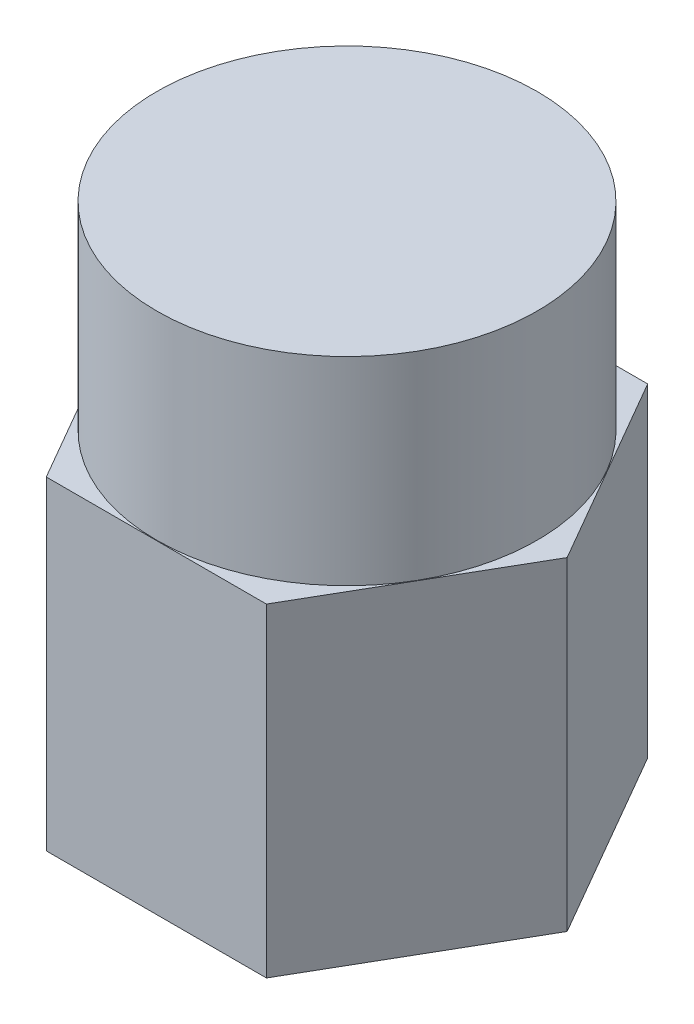
ISO-10303-21;
HEADER;
FILE_DESCRIPTION(('STEP AP214'),'2;1');
FILE_NAME('part.step','',(''),(''),'','','');
FILE_SCHEMA(('AUTOMOTIVE_DESIGN { 1 0 10303 214 1 1 1 1 }'));
ENDSEC;
DATA;
#1=APPLICATION_CONTEXT('core data for automotive mechanical design processes');
#2=APPLICATION_PROTOCOL_DEFINITION('international standard','automotive_design',2000,#1);
#3=PRODUCT_CONTEXT('',#1,'mechanical');
#4=PRODUCT('Part','Part','',(#3));
#5=PRODUCT_RELATED_PRODUCT_CATEGORY('part','',(#4));
#6=PRODUCT_DEFINITION_FORMATION('','',#4);
#7=PRODUCT_DEFINITION_CONTEXT('part definition',#1,'design');
#8=PRODUCT_DEFINITION('design','',#6,#7);
#9=PRODUCT_DEFINITION_SHAPE('','',#8);
#10=(LENGTH_UNIT() NAMED_UNIT(*) SI_UNIT(.MILLI.,.METRE.));
#11=(NAMED_UNIT(*) PLANE_ANGLE_UNIT() SI_UNIT($,.RADIAN.));
#12=(NAMED_UNIT(*) SI_UNIT($,.STERADIAN.) SOLID_ANGLE_UNIT());
#13=UNCERTAINTY_MEASURE_WITH_UNIT(LENGTH_MEASURE(1.E-05),#10,'distance_accuracy_value','');
#14=(GEOMETRIC_REPRESENTATION_CONTEXT(3) GLOBAL_UNCERTAINTY_ASSIGNED_CONTEXT((#13)) GLOBAL_UNIT_ASSIGNED_CONTEXT((#10,
#11,#12)) REPRESENTATION_CONTEXT('',''));
#15=CARTESIAN_POINT('',(0.,0.,0.));
#16=DIRECTION('',(0.,0.,1.));
#17=DIRECTION('',(1.,0.,0.));
#18=AXIS2_PLACEMENT_3D('',#15,#16,#17);
#19=CARTESIAN_POINT('',(6.32198544762641,18.6,10.95));
#20=DIRECTION('',(-0.866025403784439,0.,-0.5));
#21=DIRECTION('',(-0.5,0.,0.866025403784439));
#22=AXIS2_PLACEMENT_3D('',#19,#20,#21);
#23=PLANE('',#22);
#24=DIRECTION('',(0.5,0.,-0.866025403784439));
#25=VECTOR('',#24,1.);
#26=CARTESIAN_POINT('',(6.32198544762641,0.,10.95));
#27=LINE('',#26,#25);
#28=CARTESIAN_POINT('',(6.32198544762641,0.,10.95));
#29=VERTEX_POINT('',#28);
#30=CARTESIAN_POINT('',(12.6439708952528,0.,0.));
#31=VERTEX_POINT('',#30);
#32=EDGE_CURVE('E119',#29,#31,#27,.T.);
#33=ORIENTED_EDGE('',*,*,#32,.T.);
#34=DIRECTION('',(0.,-1.,0.));
#35=VECTOR('',#34,1.);
#36=CARTESIAN_POINT('',(12.6439708952528,18.6,0.));
#37=LINE('',#36,#35);
#38=CARTESIAN_POINT('',(12.6439708952528,18.6,0.));
#39=VERTEX_POINT('',#38);
#40=EDGE_CURVE('E36',#39,#31,#37,.T.);
#41=ORIENTED_EDGE('',*,*,#40,.F.);
#42=DIRECTION('',(0.5,0.,-0.866025403784439));
#43=VECTOR('',#42,1.);
#44=CARTESIAN_POINT('',(6.32198544762641,18.6,10.95));
#45=LINE('',#44,#43);
#46=CARTESIAN_POINT('',(6.32198544762641,18.6,10.95));
#47=VERTEX_POINT('',#46);
#48=EDGE_CURVE('E130',#47,#39,#45,.T.);
#49=ORIENTED_EDGE('',*,*,#48,.F.);
#50=DIRECTION('',(0.,-1.,0.));
#51=VECTOR('',#50,1.);
#52=CARTESIAN_POINT('',(6.32198544762641,18.6,10.95));
#53=LINE('',#52,#51);
#54=EDGE_CURVE('E115',#47,#29,#53,.T.);
#55=ORIENTED_EDGE('',*,*,#54,.T.);
#56=EDGE_LOOP('',(#33,#41,#49,#55));
#57=FACE_BOUND('',#56,.T.);
#58=ADVANCED_FACE('F33',(#57),#23,.F.);
#59=CARTESIAN_POINT('',(12.6439708952528,18.6,0.));
#60=DIRECTION('',(-0.866025403784438,0.,0.500000000000001));
#61=DIRECTION('',(0.500000000000001,0.,0.866025403784438));
#62=AXIS2_PLACEMENT_3D('',#59,#60,#61);
#63=PLANE('',#62);
#64=DIRECTION('',(-0.500000000000001,0.,-0.866025403784438));
#65=VECTOR('',#64,1.);
#66=CARTESIAN_POINT('',(12.6439708952528,0.,0.));
#67=LINE('',#66,#65);
#68=CARTESIAN_POINT('',(6.32198544762639,0.,-10.95));
#69=VERTEX_POINT('',#68);
#70=EDGE_CURVE('E122',#31,#69,#67,.T.);
#71=ORIENTED_EDGE('',*,*,#70,.T.);
#72=DIRECTION('',(0.,-1.,0.));
#73=VECTOR('',#72,1.);
#74=CARTESIAN_POINT('',(6.32198544762639,18.6,-10.95));
#75=LINE('',#74,#73);
#76=CARTESIAN_POINT('',(6.32198544762639,18.6,-10.95));
#77=VERTEX_POINT('',#76);
#78=EDGE_CURVE('E133',#77,#69,#75,.T.);
#79=ORIENTED_EDGE('',*,*,#78,.F.);
#80=DIRECTION('',(-0.500000000000001,0.,-0.866025403784438));
#81=VECTOR('',#80,1.);
#82=CARTESIAN_POINT('',(12.6439708952528,18.6,0.));
#83=LINE('',#82,#81);
#84=EDGE_CURVE('E88',#39,#77,#83,.T.);
#85=ORIENTED_EDGE('',*,*,#84,.F.);
#86=ORIENTED_EDGE('',*,*,#40,.T.);
#87=EDGE_LOOP('',(#71,#79,#85,#86));
#88=FACE_BOUND('',#87,.T.);
#89=ADVANCED_FACE('F138',(#88),#63,.F.);
#90=CARTESIAN_POINT('',(6.32198544762639,18.6,-10.95));
#91=DIRECTION('',(0.,0.,1.));
#92=DIRECTION('',(1.,0.,0.));
#93=AXIS2_PLACEMENT_3D('',#90,#91,#92);
#94=PLANE('',#93);
#95=DIRECTION('',(-1.,0.,0.));
#96=VECTOR('',#95,1.);
#97=CARTESIAN_POINT('',(6.32198544762639,0.,-10.95));
#98=LINE('',#97,#96);
#99=CARTESIAN_POINT('',(-6.32198544762641,0.,-10.95));
#100=VERTEX_POINT('',#99);
#101=EDGE_CURVE('E125',#69,#100,#98,.T.);
#102=ORIENTED_EDGE('',*,*,#101,.T.);
#103=DIRECTION('',(0.,-1.,0.));
#104=VECTOR('',#103,1.);
#105=CARTESIAN_POINT('',(-6.32198544762641,18.6,-10.95));
#106=LINE('',#105,#104);
#107=CARTESIAN_POINT('',(-6.32198544762641,18.6,-10.95));
#108=VERTEX_POINT('',#107);
#109=EDGE_CURVE('E110',#108,#100,#106,.T.);
#110=ORIENTED_EDGE('',*,*,#109,.F.);
#111=DIRECTION('',(-1.,0.,0.));
#112=VECTOR('',#111,1.);
#113=CARTESIAN_POINT('',(6.32198544762639,18.6,-10.95));
#114=LINE('',#113,#112);
#115=EDGE_CURVE('E101',#77,#108,#114,.T.);
#116=ORIENTED_EDGE('',*,*,#115,.F.);
#117=ORIENTED_EDGE('',*,*,#78,.T.);
#118=EDGE_LOOP('',(#102,#110,#116,#117));
#119=FACE_BOUND('',#118,.T.);
#120=ADVANCED_FACE('F144',(#119),#94,.F.);
#121=CARTESIAN_POINT('',(-6.32198544762641,18.6,-10.95));
#122=DIRECTION('',(0.866025403784439,0.,0.5));
#123=DIRECTION('',(0.5,0.,-0.866025403784439));
#124=AXIS2_PLACEMENT_3D('',#121,#122,#123);
#125=PLANE('',#124);
#126=DIRECTION('',(-0.5,0.,0.866025403784439));
#127=VECTOR('',#126,1.);
#128=CARTESIAN_POINT('',(-6.32198544762641,0.,-10.95));
#129=LINE('',#128,#127);
#130=CARTESIAN_POINT('',(-12.6439708952528,0.,0.));
#131=VERTEX_POINT('',#130);
#132=EDGE_CURVE('E109',#100,#131,#129,.T.);
#133=ORIENTED_EDGE('',*,*,#132,.T.);
#134=DIRECTION('',(0.,-1.,0.));
#135=VECTOR('',#134,1.);
#136=CARTESIAN_POINT('',(-12.6439708952528,18.6,0.));
#137=LINE('',#136,#135);
#138=CARTESIAN_POINT('',(-12.6439708952528,18.6,0.));
#139=VERTEX_POINT('',#138);
#140=EDGE_CURVE('E106',#139,#131,#137,.T.);
#141=ORIENTED_EDGE('',*,*,#140,.F.);
#142=DIRECTION('',(-0.5,0.,0.866025403784439));
#143=VECTOR('',#142,1.);
#144=CARTESIAN_POINT('',(-6.32198544762641,18.6,-10.95));
#145=LINE('',#144,#143);
#146=EDGE_CURVE('E95',#108,#139,#145,.T.);
#147=ORIENTED_EDGE('',*,*,#146,.F.);
#148=ORIENTED_EDGE('',*,*,#109,.T.);
#149=EDGE_LOOP('',(#133,#141,#147,#148));
#150=FACE_BOUND('',#149,.T.);
#151=ADVANCED_FACE('F107',(#150),#125,.F.);
#152=CARTESIAN_POINT('',(-12.6439708952528,18.6,0.));
#153=DIRECTION('',(0.866025403784439,0.,-0.5));
#154=DIRECTION('',(-0.5,0.,-0.866025403784438));
#155=AXIS2_PLACEMENT_3D('',#152,#153,#154);
#156=PLANE('',#155);
#157=DIRECTION('',(0.5,0.,0.866025403784439));
#158=VECTOR('',#157,1.);
#159=CARTESIAN_POINT('',(-12.6439708952528,0.,0.));
#160=LINE('',#159,#158);
#161=CARTESIAN_POINT('',(-6.32198544762641,0.,10.95));
#162=VERTEX_POINT('',#161);
#163=EDGE_CURVE('E73',#131,#162,#160,.T.);
#164=ORIENTED_EDGE('',*,*,#163,.T.);
#165=DIRECTION('',(0.,-1.,0.));
#166=VECTOR('',#165,1.);
#167=CARTESIAN_POINT('',(-6.32198544762641,18.6,10.95));
#168=LINE('',#167,#166);
#169=CARTESIAN_POINT('',(-6.32198544762641,18.6,10.95));
#170=VERTEX_POINT('',#169);
#171=EDGE_CURVE('E111',#170,#162,#168,.T.);
#172=ORIENTED_EDGE('',*,*,#171,.F.);
#173=DIRECTION('',(0.5,0.,0.866025403784439));
#174=VECTOR('',#173,1.);
#175=CARTESIAN_POINT('',(-12.6439708952528,18.6,0.));
#176=LINE('',#175,#174);
#177=EDGE_CURVE('E99',#139,#170,#176,.T.);
#178=ORIENTED_EDGE('',*,*,#177,.F.);
#179=ORIENTED_EDGE('',*,*,#140,.T.);
#180=EDGE_LOOP('',(#164,#172,#178,#179));
#181=FACE_BOUND('',#180,.T.);
#182=ADVANCED_FACE('F113',(#181),#156,.F.);
#183=CARTESIAN_POINT('',(-6.32198544762641,18.6,10.95));
#184=DIRECTION('',(0.,0.,-1.));
#185=DIRECTION('',(-1.,0.,0.));
#186=AXIS2_PLACEMENT_3D('',#183,#184,#185);
#187=PLANE('',#186);
#188=DIRECTION('',(1.,0.,0.));
#189=VECTOR('',#188,1.);
#190=CARTESIAN_POINT('',(-6.32198544762641,0.,10.95));
#191=LINE('',#190,#189);
#192=EDGE_CURVE('E79',#162,#29,#191,.T.);
#193=ORIENTED_EDGE('',*,*,#192,.T.);
#194=ORIENTED_EDGE('',*,*,#54,.F.);
#195=DIRECTION('',(1.,0.,0.));
#196=VECTOR('',#195,1.);
#197=CARTESIAN_POINT('',(-6.32198544762641,18.6,10.95));
#198=LINE('',#197,#196);
#199=EDGE_CURVE('E50',#170,#47,#198,.T.);
#200=ORIENTED_EDGE('',*,*,#199,.F.);
#201=ORIENTED_EDGE('',*,*,#171,.T.);
#202=EDGE_LOOP('',(#193,#194,#200,#201));
#203=FACE_BOUND('',#202,.T.);
#204=ADVANCED_FACE('F160',(#203),#187,.F.);
#205=CARTESIAN_POINT('',(0.,18.6,0.));
#206=DIRECTION('',(0.,1.,0.));
#207=DIRECTION('',(0.,0.,1.));
#208=AXIS2_PLACEMENT_3D('',#205,#206,#207);
#209=PLANE('',#208);
#210=CARTESIAN_POINT('',(0.,18.6,0.));
#211=DIRECTION('',(0.,1.,0.));
#212=DIRECTION('',(0.,0.,1.));
#213=AXIS2_PLACEMENT_3D('',#210,#211,#212);
#214=CIRCLE('',#213,10.925);
#215=CARTESIAN_POINT('',(0.,18.6,10.925));
#216=VERTEX_POINT('',#215);
#217=EDGE_CURVE('E11',#216,#216,#214,.T.);
#218=ORIENTED_EDGE('',*,*,#217,.F.);
#219=EDGE_LOOP('',(#218));
#220=FACE_BOUND('',#219,.T.);
#221=ORIENTED_EDGE('',*,*,#48,.T.);
#222=ORIENTED_EDGE('',*,*,#84,.T.);
#223=ORIENTED_EDGE('',*,*,#115,.T.);
#224=ORIENTED_EDGE('',*,*,#146,.T.);
#225=ORIENTED_EDGE('',*,*,#177,.T.);
#226=ORIENTED_EDGE('',*,*,#199,.T.);
#227=EDGE_LOOP('',(#221,#222,#223,#224,#225,#226));
#228=FACE_BOUND('',#227,.T.);
#229=ADVANCED_FACE('F97',(#220,#228),#209,.T.);
#230=CARTESIAN_POINT('',(0.,0.,0.));
#231=DIRECTION('',(0.,1.,0.));
#232=DIRECTION('',(0.,0.,1.));
#233=AXIS2_PLACEMENT_3D('',#230,#231,#232);
#234=PLANE('',#233);
#235=ORIENTED_EDGE('',*,*,#32,.F.);
#236=ORIENTED_EDGE('',*,*,#192,.F.);
#237=ORIENTED_EDGE('',*,*,#163,.F.);
#238=ORIENTED_EDGE('',*,*,#132,.F.);
#239=ORIENTED_EDGE('',*,*,#101,.F.);
#240=ORIENTED_EDGE('',*,*,#70,.F.);
#241=EDGE_LOOP('',(#235,#236,#237,#238,#239,#240));
#242=FACE_BOUND('',#241,.T.);
#243=ADVANCED_FACE('F143',(#242),#234,.F.);
#244=CARTESIAN_POINT('',(0.,30.,0.));
#245=DIRECTION('',(0.,-1.,0.));
#246=DIRECTION('',(0.,0.,-1.));
#247=AXIS2_PLACEMENT_3D('',#244,#245,#246);
#248=CYLINDRICAL_SURFACE('',#247,10.925);
#249=CARTESIAN_POINT('',(0.,30.,0.));
#250=DIRECTION('',(0.,1.,0.));
#251=DIRECTION('',(0.,0.,1.));
#252=AXIS2_PLACEMENT_3D('',#249,#250,#251);
#253=CIRCLE('',#252,10.925);
#254=CARTESIAN_POINT('',(0.,30.,10.925));
#255=VERTEX_POINT('',#254);
#256=EDGE_CURVE('E123',#255,#255,#253,.T.);
#257=ORIENTED_EDGE('',*,*,#256,.F.);
#258=EDGE_LOOP('',(#257));
#259=FACE_BOUND('',#258,.T.);
#260=ORIENTED_EDGE('',*,*,#217,.T.);
#261=EDGE_LOOP('',(#260));
#262=FACE_BOUND('',#261,.T.);
#263=ADVANCED_FACE('F153',(#259,#262),#248,.T.);
#264=CARTESIAN_POINT('',(0.,30.,0.));
#265=DIRECTION('',(0.,1.,0.));
#266=DIRECTION('',(0.,0.,1.));
#267=AXIS2_PLACEMENT_3D('',#264,#265,#266);
#268=PLANE('',#267);
#269=ORIENTED_EDGE('',*,*,#256,.T.);
#270=EDGE_LOOP('',(#269));
#271=FACE_BOUND('',#270,.T.);
#272=ADVANCED_FACE('F151',(#271),#268,.T.);
#273=CLOSED_SHELL('',(#58,#89,#120,#151,#182,#204,#229,#243,#263,#272));
#274=MANIFOLD_SOLID_BREP('B2',#273);
#275=ADVANCED_BREP_SHAPE_REPRESENTATION('',(#18,#274),#14);
#276=SHAPE_DEFINITION_REPRESENTATION(#9,#275);
ENDSEC;
END-ISO-10303-21;
